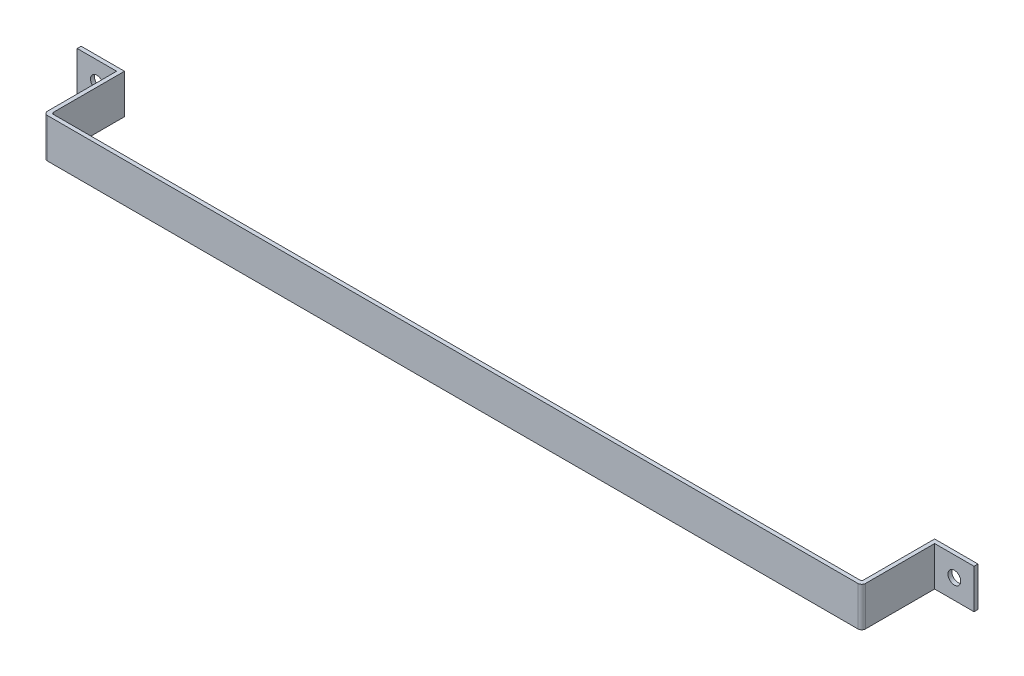
ISO-10303-21;
HEADER;
FILE_DESCRIPTION(('STEP AP214'),'2;1');
FILE_NAME('part.step','',(''),(''),'','','');
FILE_SCHEMA(('AUTOMOTIVE_DESIGN { 1 0 10303 214 1 1 1 1 }'));
ENDSEC;
DATA;
#1=APPLICATION_CONTEXT('core data for automotive mechanical design processes');
#2=APPLICATION_PROTOCOL_DEFINITION('international standard','automotive_design',2000,#1);
#3=PRODUCT_CONTEXT('',#1,'mechanical');
#4=PRODUCT('Part','Part','',(#3));
#5=PRODUCT_RELATED_PRODUCT_CATEGORY('part','',(#4));
#6=PRODUCT_DEFINITION_FORMATION('','',#4);
#7=PRODUCT_DEFINITION_CONTEXT('part definition',#1,'design');
#8=PRODUCT_DEFINITION('design','',#6,#7);
#9=PRODUCT_DEFINITION_SHAPE('','',#8);
#10=(LENGTH_UNIT() NAMED_UNIT(*) SI_UNIT(.MILLI.,.METRE.));
#11=(NAMED_UNIT(*) PLANE_ANGLE_UNIT() SI_UNIT($,.RADIAN.));
#12=(NAMED_UNIT(*) SI_UNIT($,.STERADIAN.) SOLID_ANGLE_UNIT());
#13=UNCERTAINTY_MEASURE_WITH_UNIT(LENGTH_MEASURE(1.E-05),#10,'distance_accuracy_value','');
#14=(GEOMETRIC_REPRESENTATION_CONTEXT(3) GLOBAL_UNCERTAINTY_ASSIGNED_CONTEXT((#13)) GLOBAL_UNIT_ASSIGNED_CONTEXT((#10,
#11,#12)) REPRESENTATION_CONTEXT('',''));
#15=CARTESIAN_POINT('',(0.,0.,0.));
#16=DIRECTION('',(0.,0.,1.));
#17=DIRECTION('',(1.,0.,0.));
#18=AXIS2_PLACEMENT_3D('',#15,#16,#17);
#19=CARTESIAN_POINT('',(425.,-10.,-2.));
#20=DIRECTION('',(1.,0.,0.));
#21=DIRECTION('',(0.,0.,-1.));
#22=AXIS2_PLACEMENT_3D('',#19,#20,#21);
#23=PLANE('',#22);
#24=DIRECTION('',(0.,0.,-1.));
#25=VECTOR('',#24,1.);
#26=CARTESIAN_POINT('',(425.,10.,-2.));
#27=LINE('',#26,#25);
#28=CARTESIAN_POINT('',(425.,10.,0.));
#29=VERTEX_POINT('',#28);
#30=CARTESIAN_POINT('',(425.,10.,35.));
#31=VERTEX_POINT('',#30);
#32=EDGE_CURVE('E183',#29,#31,#27,.F.);
#33=ORIENTED_EDGE('',*,*,#32,.T.);
#34=DIRECTION('',(0.,1.,0.));
#35=VECTOR('',#34,1.);
#36=CARTESIAN_POINT('',(425.,-10.,35.));
#37=LINE('',#36,#35);
#38=CARTESIAN_POINT('',(425.,-10.,35.));
#39=VERTEX_POINT('',#38);
#40=EDGE_CURVE('E275',#31,#39,#37,.F.);
#41=ORIENTED_EDGE('',*,*,#40,.T.);
#42=DIRECTION('',(0.,0.,1.));
#43=VECTOR('',#42,1.);
#44=CARTESIAN_POINT('',(425.,-10.,-2.));
#45=LINE('',#44,#43);
#46=CARTESIAN_POINT('',(425.,-10.,0.));
#47=VERTEX_POINT('',#46);
#48=EDGE_CURVE('E186',#47,#39,#45,.T.);
#49=ORIENTED_EDGE('',*,*,#48,.F.);
#50=DIRECTION('',(0.,1.,0.));
#51=VECTOR('',#50,1.);
#52=CARTESIAN_POINT('',(425.,-10.,0.));
#53=LINE('',#52,#51);
#54=EDGE_CURVE('E134',#47,#29,#53,.T.);
#55=ORIENTED_EDGE('',*,*,#54,.T.);
#56=EDGE_LOOP('',(#33,#41,#49,#55));
#57=FACE_BOUND('',#56,.T.);
#58=ADVANCED_FACE('F17',(#57),#23,.T.);
#59=CARTESIAN_POINT('',(12.,-10.,-2.));
#60=DIRECTION('',(1.,0.,0.));
#61=DIRECTION('',(0.,0.,-1.));
#62=AXIS2_PLACEMENT_3D('',#59,#60,#61);
#63=PLANE('',#62);
#64=DIRECTION('',(0.,0.,1.));
#65=VECTOR('',#64,1.);
#66=CARTESIAN_POINT('',(12.,10.,-2.));
#67=LINE('',#66,#65);
#68=CARTESIAN_POINT('',(12.,10.,-2.));
#69=VERTEX_POINT('',#68);
#70=CARTESIAN_POINT('',(12.,10.,34.));
#71=VERTEX_POINT('',#70);
#72=EDGE_CURVE('E236',#69,#71,#67,.T.);
#73=ORIENTED_EDGE('',*,*,#72,.T.);
#74=DIRECTION('',(0.,-1.,0.));
#75=VECTOR('',#74,1.);
#76=CARTESIAN_POINT('',(12.,-10.,34.));
#77=LINE('',#76,#75);
#78=CARTESIAN_POINT('',(12.,-10.,34.));
#79=VERTEX_POINT('',#78);
#80=EDGE_CURVE('E245',#71,#79,#77,.T.);
#81=ORIENTED_EDGE('',*,*,#80,.T.);
#82=DIRECTION('',(0.,0.,1.));
#83=VECTOR('',#82,1.);
#84=CARTESIAN_POINT('',(12.,-10.,-2.));
#85=LINE('',#84,#83);
#86=CARTESIAN_POINT('',(12.,-10.,-2.));
#87=VERTEX_POINT('',#86);
#88=EDGE_CURVE('E239',#87,#79,#85,.T.);
#89=ORIENTED_EDGE('',*,*,#88,.F.);
#90=DIRECTION('',(0.,1.,0.));
#91=VECTOR('',#90,1.);
#92=CARTESIAN_POINT('',(12.,-10.,-2.));
#93=LINE('',#92,#91);
#94=EDGE_CURVE('E215',#87,#69,#93,.T.);
#95=ORIENTED_EDGE('',*,*,#94,.T.);
#96=EDGE_LOOP('',(#73,#81,#89,#95));
#97=FACE_BOUND('',#96,.T.);
#98=ADVANCED_FACE('F305',(#97),#63,.T.);
#99=CARTESIAN_POINT('',(0.,0.,0.));
#100=DIRECTION('',(0.,0.,1.));
#101=DIRECTION('',(1.,0.,0.));
#102=AXIS2_PLACEMENT_3D('',#99,#100,#101);
#103=PLANE('',#102);
#104=CARTESIAN_POINT('',(0.,0.,0.));
#105=DIRECTION('',(0.,0.,-1.));
#106=DIRECTION('',(0.,1.,0.));
#107=AXIS2_PLACEMENT_3D('',#104,#105,#106);
#108=CIRCLE('',#107,3.25);
#109=CARTESIAN_POINT('',(0.,3.25,0.));
#110=VERTEX_POINT('',#109);
#111=EDGE_CURVE('E250',#110,#110,#108,.T.);
#112=ORIENTED_EDGE('',*,*,#111,.T.);
#113=EDGE_LOOP('',(#112));
#114=FACE_BOUND('',#113,.T.);
#115=DIRECTION('',(1.,0.,0.));
#116=VECTOR('',#115,1.);
#117=CARTESIAN_POINT('',(-10.,-10.,0.));
#118=LINE('',#117,#116);
#119=CARTESIAN_POINT('',(-10.,-10.,0.));
#120=VERTEX_POINT('',#119);
#121=CARTESIAN_POINT('',(10.,-10.,0.));
#122=VERTEX_POINT('',#121);
#123=EDGE_CURVE('E208',#120,#122,#118,.T.);
#124=ORIENTED_EDGE('',*,*,#123,.T.);
#125=DIRECTION('',(0.,1.,0.));
#126=VECTOR('',#125,1.);
#127=CARTESIAN_POINT('',(10.,0.,0.));
#128=LINE('',#127,#126);
#129=CARTESIAN_POINT('',(10.,10.,0.));
#130=VERTEX_POINT('',#129);
#131=EDGE_CURVE('E194',#122,#130,#128,.T.);
#132=ORIENTED_EDGE('',*,*,#131,.T.);
#133=DIRECTION('',(-1.,0.,0.));
#134=VECTOR('',#133,1.);
#135=CARTESIAN_POINT('',(10.,10.,0.));
#136=LINE('',#135,#134);
#137=CARTESIAN_POINT('',(-10.,10.,0.));
#138=VERTEX_POINT('',#137);
#139=EDGE_CURVE('E223',#130,#138,#136,.T.);
#140=ORIENTED_EDGE('',*,*,#139,.T.);
#141=DIRECTION('',(0.,-1.,0.));
#142=VECTOR('',#141,1.);
#143=CARTESIAN_POINT('',(-10.,10.,0.));
#144=LINE('',#143,#142);
#145=EDGE_CURVE('E222',#138,#120,#144,.T.);
#146=ORIENTED_EDGE('',*,*,#145,.T.);
#147=EDGE_LOOP('',(#124,#132,#140,#146));
#148=FACE_BOUND('',#147,.T.);
#149=ADVANCED_FACE('F294',(#114,#148),#103,.T.);
#150=CARTESIAN_POINT('',(-10.,-10.,-2.));
#151=DIRECTION('',(0.,-1.,0.));
#152=DIRECTION('',(0.,0.,-1.));
#153=AXIS2_PLACEMENT_3D('',#150,#151,#152);
#154=PLANE('',#153);
#155=DIRECTION('',(-1.,0.,0.));
#156=VECTOR('',#155,1.);
#157=CARTESIAN_POINT('',(-10.,-10.,37.));
#158=LINE('',#157,#156);
#159=CARTESIAN_POINT('',(12.,-10.,37.));
#160=VERTEX_POINT('',#159);
#161=CARTESIAN_POINT('',(423.,-10.,37.));
#162=VERTEX_POINT('',#161);
#163=EDGE_CURVE('E201',#160,#162,#158,.F.);
#164=ORIENTED_EDGE('',*,*,#163,.F.);
#165=CARTESIAN_POINT('',(12.,-10.,35.));
#166=DIRECTION('',(0.,-1.,0.));
#167=DIRECTION('',(0.,0.,-1.));
#168=AXIS2_PLACEMENT_3D('',#165,#166,#167);
#169=CIRCLE('',#168,2.);
#170=CARTESIAN_POINT('',(10.,-10.,35.));
#171=VERTEX_POINT('',#170);
#172=EDGE_CURVE('E11',#160,#171,#169,.T.);
#173=ORIENTED_EDGE('',*,*,#172,.T.);
#174=DIRECTION('',(0.,0.,1.));
#175=VECTOR('',#174,1.);
#176=CARTESIAN_POINT('',(10.,-10.,37.));
#177=LINE('',#176,#175);
#178=EDGE_CURVE('E206',#171,#122,#177,.F.);
#179=ORIENTED_EDGE('',*,*,#178,.T.);
#180=ORIENTED_EDGE('',*,*,#123,.F.);
#181=DIRECTION('',(0.,0.,1.));
#182=VECTOR('',#181,1.);
#183=CARTESIAN_POINT('',(-10.,-10.,-2.));
#184=LINE('',#183,#182);
#185=CARTESIAN_POINT('',(-10.,-10.,-2.));
#186=VERTEX_POINT('',#185);
#187=EDGE_CURVE('E218',#186,#120,#184,.T.);
#188=ORIENTED_EDGE('',*,*,#187,.F.);
#189=DIRECTION('',(1.,0.,0.));
#190=VECTOR('',#189,1.);
#191=CARTESIAN_POINT('',(-10.,-10.,-2.));
#192=LINE('',#191,#190);
#193=EDGE_CURVE('E219',#186,#87,#192,.T.);
#194=ORIENTED_EDGE('',*,*,#193,.T.);
#195=ORIENTED_EDGE('',*,*,#88,.T.);
#196=CARTESIAN_POINT('',(13.,-10.,34.));
#197=DIRECTION('',(0.,-1.,0.));
#198=DIRECTION('',(0.,0.,-1.));
#199=AXIS2_PLACEMENT_3D('',#196,#197,#198);
#200=CIRCLE('',#199,1.);
#201=CARTESIAN_POINT('',(13.,-10.,35.));
#202=VERTEX_POINT('',#201);
#203=EDGE_CURVE('E256',#79,#202,#200,.F.);
#204=ORIENTED_EDGE('',*,*,#203,.T.);
#205=DIRECTION('',(-1.,0.,0.));
#206=VECTOR('',#205,1.);
#207=CARTESIAN_POINT('',(425.,-10.,35.));
#208=LINE('',#207,#206);
#209=CARTESIAN_POINT('',(422.,-10.,35.));
#210=VERTEX_POINT('',#209);
#211=EDGE_CURVE('E189',#210,#202,#208,.T.);
#212=ORIENTED_EDGE('',*,*,#211,.F.);
#213=CARTESIAN_POINT('',(422.,-10.,34.));
#214=DIRECTION('',(0.,-1.,0.));
#215=DIRECTION('',(0.,0.,-1.));
#216=AXIS2_PLACEMENT_3D('',#213,#214,#215);
#217=CIRCLE('',#216,1.);
#218=CARTESIAN_POINT('',(423.,-10.,34.));
#219=VERTEX_POINT('',#218);
#220=EDGE_CURVE('E266',#210,#219,#217,.F.);
#221=ORIENTED_EDGE('',*,*,#220,.T.);
#222=DIRECTION('',(0.,0.,1.));
#223=VECTOR('',#222,1.);
#224=CARTESIAN_POINT('',(423.,-10.,-2.));
#225=LINE('',#224,#223);
#226=CARTESIAN_POINT('',(423.,-10.,-2.));
#227=VERTEX_POINT('',#226);
#228=EDGE_CURVE('E177',#227,#219,#225,.T.);
#229=ORIENTED_EDGE('',*,*,#228,.F.);
#230=DIRECTION('',(-1.,0.,0.));
#231=VECTOR('',#230,1.);
#232=CARTESIAN_POINT('',(425.,-10.,-2.));
#233=LINE('',#232,#231);
#234=CARTESIAN_POINT('',(445.,-10.,-2.));
#235=VERTEX_POINT('',#234);
#236=EDGE_CURVE('E155',#235,#227,#233,.T.);
#237=ORIENTED_EDGE('',*,*,#236,.F.);
#238=DIRECTION('',(0.,0.,1.));
#239=VECTOR('',#238,1.);
#240=CARTESIAN_POINT('',(445.,-10.,-2.));
#241=LINE('',#240,#239);
#242=CARTESIAN_POINT('',(445.,-10.,0.));
#243=VERTEX_POINT('',#242);
#244=EDGE_CURVE('E146',#235,#243,#241,.T.);
#245=ORIENTED_EDGE('',*,*,#244,.T.);
#246=DIRECTION('',(-1.,0.,0.));
#247=VECTOR('',#246,1.);
#248=CARTESIAN_POINT('',(445.,-10.,0.));
#249=LINE('',#248,#247);
#250=EDGE_CURVE('E129',#243,#47,#249,.T.);
#251=ORIENTED_EDGE('',*,*,#250,.T.);
#252=ORIENTED_EDGE('',*,*,#48,.T.);
#253=CARTESIAN_POINT('',(423.,-10.,35.));
#254=DIRECTION('',(0.,-1.,0.));
#255=DIRECTION('',(0.,0.,-1.));
#256=AXIS2_PLACEMENT_3D('',#253,#254,#255);
#257=CIRCLE('',#256,2.);
#258=EDGE_CURVE('E277',#39,#162,#257,.T.);
#259=ORIENTED_EDGE('',*,*,#258,.T.);
#260=EDGE_LOOP('',(#164,#173,#179,#180,#188,#194,#195,#204,#212,#221,#229,#237,#245,#251,#252,#259));
#261=FACE_BOUND('',#260,.T.);
#262=ADVANCED_FACE('F153',(#261),#154,.T.);
#263=CARTESIAN_POINT('',(10.,10.,-2.));
#264=DIRECTION('',(0.,1.,0.));
#265=DIRECTION('',(0.,0.,1.));
#266=AXIS2_PLACEMENT_3D('',#263,#264,#265);
#267=PLANE('',#266);
#268=DIRECTION('',(0.,0.,-1.));
#269=VECTOR('',#268,1.);
#270=CARTESIAN_POINT('',(10.,10.,37.));
#271=LINE('',#270,#269);
#272=CARTESIAN_POINT('',(10.,10.,35.));
#273=VERTEX_POINT('',#272);
#274=EDGE_CURVE('E200',#273,#130,#271,.T.);
#275=ORIENTED_EDGE('',*,*,#274,.F.);
#276=CARTESIAN_POINT('',(12.,10.,35.));
#277=DIRECTION('',(0.,1.,0.));
#278=DIRECTION('',(0.,0.,1.));
#279=AXIS2_PLACEMENT_3D('',#276,#277,#278);
#280=CIRCLE('',#279,2.);
#281=CARTESIAN_POINT('',(12.,10.,37.));
#282=VERTEX_POINT('',#281);
#283=EDGE_CURVE('E39',#273,#282,#280,.T.);
#284=ORIENTED_EDGE('',*,*,#283,.T.);
#285=DIRECTION('',(-1.,0.,0.));
#286=VECTOR('',#285,1.);
#287=CARTESIAN_POINT('',(10.,10.,37.));
#288=LINE('',#287,#286);
#289=CARTESIAN_POINT('',(423.,10.,37.));
#290=VERTEX_POINT('',#289);
#291=EDGE_CURVE('E197',#290,#282,#288,.T.);
#292=ORIENTED_EDGE('',*,*,#291,.F.);
#293=CARTESIAN_POINT('',(423.,10.,35.));
#294=DIRECTION('',(0.,1.,0.));
#295=DIRECTION('',(0.,0.,1.));
#296=AXIS2_PLACEMENT_3D('',#293,#294,#295);
#297=CIRCLE('',#296,2.);
#298=EDGE_CURVE('E273',#290,#31,#297,.T.);
#299=ORIENTED_EDGE('',*,*,#298,.T.);
#300=ORIENTED_EDGE('',*,*,#32,.F.);
#301=DIRECTION('',(1.,0.,0.));
#302=VECTOR('',#301,1.);
#303=CARTESIAN_POINT('',(10.,10.,0.));
#304=LINE('',#303,#302);
#305=CARTESIAN_POINT('',(445.,10.,0.));
#306=VERTEX_POINT('',#305);
#307=EDGE_CURVE('E140',#306,#29,#304,.F.);
#308=ORIENTED_EDGE('',*,*,#307,.F.);
#309=DIRECTION('',(0.,0.,-1.));
#310=VECTOR('',#309,1.);
#311=CARTESIAN_POINT('',(445.,10.,-2.));
#312=LINE('',#311,#310);
#313=CARTESIAN_POINT('',(445.,10.,-2.));
#314=VERTEX_POINT('',#313);
#315=EDGE_CURVE('E149',#314,#306,#312,.F.);
#316=ORIENTED_EDGE('',*,*,#315,.F.);
#317=DIRECTION('',(-1.,0.,0.));
#318=VECTOR('',#317,1.);
#319=CARTESIAN_POINT('',(10.,10.,-2.));
#320=LINE('',#319,#318);
#321=CARTESIAN_POINT('',(423.,10.,-2.));
#322=VERTEX_POINT('',#321);
#323=EDGE_CURVE('E174',#314,#322,#320,.T.);
#324=ORIENTED_EDGE('',*,*,#323,.T.);
#325=DIRECTION('',(0.,0.,1.));
#326=VECTOR('',#325,1.);
#327=CARTESIAN_POINT('',(423.,10.,-2.));
#328=LINE('',#327,#326);
#329=CARTESIAN_POINT('',(423.,10.,34.));
#330=VERTEX_POINT('',#329);
#331=EDGE_CURVE('E180',#322,#330,#328,.T.);
#332=ORIENTED_EDGE('',*,*,#331,.T.);
#333=CARTESIAN_POINT('',(422.,10.,34.));
#334=DIRECTION('',(0.,1.,0.));
#335=DIRECTION('',(0.,0.,1.));
#336=AXIS2_PLACEMENT_3D('',#333,#334,#335);
#337=CIRCLE('',#336,1.);
#338=CARTESIAN_POINT('',(422.,10.,35.));
#339=VERTEX_POINT('',#338);
#340=EDGE_CURVE('E268',#330,#339,#337,.F.);
#341=ORIENTED_EDGE('',*,*,#340,.T.);
#342=DIRECTION('',(1.,0.,0.));
#343=VECTOR('',#342,1.);
#344=CARTESIAN_POINT('',(425.,10.,35.));
#345=LINE('',#344,#343);
#346=CARTESIAN_POINT('',(13.,10.,35.));
#347=VERTEX_POINT('',#346);
#348=EDGE_CURVE('E192',#339,#347,#345,.F.);
#349=ORIENTED_EDGE('',*,*,#348,.T.);
#350=CARTESIAN_POINT('',(13.,10.,34.));
#351=DIRECTION('',(0.,1.,0.));
#352=DIRECTION('',(0.,0.,1.));
#353=AXIS2_PLACEMENT_3D('',#350,#351,#352);
#354=CIRCLE('',#353,1.);
#355=EDGE_CURVE('E259',#347,#71,#354,.F.);
#356=ORIENTED_EDGE('',*,*,#355,.T.);
#357=ORIENTED_EDGE('',*,*,#72,.F.);
#358=DIRECTION('',(-1.,0.,0.));
#359=VECTOR('',#358,1.);
#360=CARTESIAN_POINT('',(10.,10.,-2.));
#361=LINE('',#360,#359);
#362=CARTESIAN_POINT('',(-10.,10.,-2.));
#363=VERTEX_POINT('',#362);
#364=EDGE_CURVE('E211',#69,#363,#361,.T.);
#365=ORIENTED_EDGE('',*,*,#364,.T.);
#366=DIRECTION('',(0.,0.,1.));
#367=VECTOR('',#366,1.);
#368=CARTESIAN_POINT('',(-10.,10.,-2.));
#369=LINE('',#368,#367);
#370=EDGE_CURVE('E233',#363,#138,#369,.T.);
#371=ORIENTED_EDGE('',*,*,#370,.T.);
#372=ORIENTED_EDGE('',*,*,#139,.F.);
#373=EDGE_LOOP('',(#275,#284,#292,#299,#300,#308,#316,#324,#332,#341,#349,#356,#357,#365,#371,#372));
#374=FACE_BOUND('',#373,.T.);
#375=ADVANCED_FACE('F291',(#374),#267,.T.);
#376=CARTESIAN_POINT('',(-10.,10.,-2.));
#377=DIRECTION('',(-1.,0.,0.));
#378=DIRECTION('',(0.,0.,1.));
#379=AXIS2_PLACEMENT_3D('',#376,#377,#378);
#380=PLANE('',#379);
#381=ORIENTED_EDGE('',*,*,#145,.F.);
#382=ORIENTED_EDGE('',*,*,#370,.F.);
#383=DIRECTION('',(0.,-1.,0.));
#384=VECTOR('',#383,1.);
#385=CARTESIAN_POINT('',(-10.,10.,-2.));
#386=LINE('',#385,#384);
#387=EDGE_CURVE('E214',#363,#186,#386,.T.);
#388=ORIENTED_EDGE('',*,*,#387,.T.);
#389=ORIENTED_EDGE('',*,*,#187,.T.);
#390=EDGE_LOOP('',(#381,#382,#388,#389));
#391=FACE_BOUND('',#390,.T.);
#392=ADVANCED_FACE('F329',(#391),#380,.T.);
#393=CARTESIAN_POINT('',(0.,0.,-2.));
#394=DIRECTION('',(0.,0.,1.));
#395=DIRECTION('',(1.,0.,0.));
#396=AXIS2_PLACEMENT_3D('',#393,#394,#395);
#397=PLANE('',#396);
#398=CARTESIAN_POINT('',(0.,0.,-2.));
#399=DIRECTION('',(0.,0.,1.));
#400=DIRECTION('',(1.,0.,0.));
#401=AXIS2_PLACEMENT_3D('',#398,#399,#400);
#402=CIRCLE('',#401,3.25);
#403=CARTESIAN_POINT('',(3.25,0.,-2.));
#404=VERTEX_POINT('',#403);
#405=EDGE_CURVE('E246',#404,#404,#402,.F.);
#406=ORIENTED_EDGE('',*,*,#405,.F.);
#407=EDGE_LOOP('',(#406));
#408=FACE_BOUND('',#407,.T.);
#409=ORIENTED_EDGE('',*,*,#193,.F.);
#410=ORIENTED_EDGE('',*,*,#387,.F.);
#411=ORIENTED_EDGE('',*,*,#364,.F.);
#412=ORIENTED_EDGE('',*,*,#94,.F.);
#413=EDGE_LOOP('',(#409,#410,#411,#412));
#414=FACE_BOUND('',#413,.T.);
#415=ADVANCED_FACE('F326',(#408,#414),#397,.F.);
#416=CARTESIAN_POINT('',(10.,0.,37.));
#417=DIRECTION('',(-1.,0.,0.));
#418=DIRECTION('',(0.,0.,1.));
#419=AXIS2_PLACEMENT_3D('',#416,#417,#418);
#420=PLANE('',#419);
#421=ORIENTED_EDGE('',*,*,#178,.F.);
#422=DIRECTION('',(0.,1.,0.));
#423=VECTOR('',#422,1.);
#424=CARTESIAN_POINT('',(10.,0.,35.));
#425=LINE('',#424,#423);
#426=EDGE_CURVE('E280',#171,#273,#425,.T.);
#427=ORIENTED_EDGE('',*,*,#426,.T.);
#428=ORIENTED_EDGE('',*,*,#274,.T.);
#429=ORIENTED_EDGE('',*,*,#131,.F.);
#430=EDGE_LOOP('',(#421,#427,#428,#429));
#431=FACE_BOUND('',#430,.T.);
#432=ADVANCED_FACE('F286',(#431),#420,.T.);
#433=CARTESIAN_POINT('',(0.,0.,37.));
#434=DIRECTION('',(0.,0.,1.));
#435=DIRECTION('',(1.,0.,0.));
#436=AXIS2_PLACEMENT_3D('',#433,#434,#435);
#437=PLANE('',#436);
#438=ORIENTED_EDGE('',*,*,#291,.T.);
#439=DIRECTION('',(0.,1.,0.));
#440=VECTOR('',#439,1.);
#441=CARTESIAN_POINT('',(12.,0.,37.));
#442=LINE('',#441,#440);
#443=EDGE_CURVE('E25',#282,#160,#442,.F.);
#444=ORIENTED_EDGE('',*,*,#443,.T.);
#445=ORIENTED_EDGE('',*,*,#163,.T.);
#446=DIRECTION('',(0.,1.,0.));
#447=VECTOR('',#446,1.);
#448=CARTESIAN_POINT('',(423.,0.,37.));
#449=LINE('',#448,#447);
#450=EDGE_CURVE('E270',#162,#290,#449,.T.);
#451=ORIENTED_EDGE('',*,*,#450,.T.);
#452=EDGE_LOOP('',(#438,#444,#445,#451));
#453=FACE_BOUND('',#452,.T.);
#454=ADVANCED_FACE('F320',(#453),#437,.T.);
#455=CARTESIAN_POINT('',(425.,-10.,35.));
#456=DIRECTION('',(0.,0.,-1.));
#457=DIRECTION('',(-1.,0.,0.));
#458=AXIS2_PLACEMENT_3D('',#455,#456,#457);
#459=PLANE('',#458);
#460=ORIENTED_EDGE('',*,*,#348,.F.);
#461=DIRECTION('',(0.,-1.,0.));
#462=VECTOR('',#461,1.);
#463=CARTESIAN_POINT('',(422.,-10.,35.));
#464=LINE('',#463,#462);
#465=EDGE_CURVE('E261',#339,#210,#464,.T.);
#466=ORIENTED_EDGE('',*,*,#465,.T.);
#467=ORIENTED_EDGE('',*,*,#211,.T.);
#468=DIRECTION('',(0.,-1.,0.));
#469=VECTOR('',#468,1.);
#470=CARTESIAN_POINT('',(13.,10.,35.));
#471=LINE('',#470,#469);
#472=EDGE_CURVE('E253',#202,#347,#471,.F.);
#473=ORIENTED_EDGE('',*,*,#472,.T.);
#474=EDGE_LOOP('',(#460,#466,#467,#473));
#475=FACE_BOUND('',#474,.T.);
#476=ADVANCED_FACE('F317',(#475),#459,.T.);
#477=CARTESIAN_POINT('',(423.,-10.,-2.));
#478=DIRECTION('',(-1.,0.,0.));
#479=DIRECTION('',(0.,0.,1.));
#480=AXIS2_PLACEMENT_3D('',#477,#478,#479);
#481=PLANE('',#480);
#482=ORIENTED_EDGE('',*,*,#228,.T.);
#483=DIRECTION('',(0.,-1.,0.));
#484=VECTOR('',#483,1.);
#485=CARTESIAN_POINT('',(423.,10.,34.));
#486=LINE('',#485,#484);
#487=EDGE_CURVE('E264',#219,#330,#486,.F.);
#488=ORIENTED_EDGE('',*,*,#487,.T.);
#489=ORIENTED_EDGE('',*,*,#331,.F.);
#490=DIRECTION('',(0.,-1.,0.));
#491=VECTOR('',#490,1.);
#492=CARTESIAN_POINT('',(423.,-10.,-2.));
#493=LINE('',#492,#491);
#494=EDGE_CURVE('E139',#322,#227,#493,.T.);
#495=ORIENTED_EDGE('',*,*,#494,.T.);
#496=EDGE_LOOP('',(#482,#488,#489,#495));
#497=FACE_BOUND('',#496,.T.);
#498=ADVANCED_FACE('F315',(#497),#481,.T.);
#499=CARTESIAN_POINT('',(425.,-10.,-2.));
#500=DIRECTION('',(0.,0.,-1.));
#501=DIRECTION('',(-1.,0.,0.));
#502=AXIS2_PLACEMENT_3D('',#499,#500,#501);
#503=PLANE('',#502);
#504=CARTESIAN_POINT('',(435.,0.,-2.));
#505=DIRECTION('',(0.,0.,-1.));
#506=DIRECTION('',(-1.,0.,0.));
#507=AXIS2_PLACEMENT_3D('',#504,#505,#506);
#508=CIRCLE('',#507,3.25);
#509=CARTESIAN_POINT('',(431.75,0.,-2.));
#510=VERTEX_POINT('',#509);
#511=EDGE_CURVE('E167',#510,#510,#508,.F.);
#512=ORIENTED_EDGE('',*,*,#511,.T.);
#513=EDGE_LOOP('',(#512));
#514=FACE_BOUND('',#513,.T.);
#515=ORIENTED_EDGE('',*,*,#494,.F.);
#516=ORIENTED_EDGE('',*,*,#323,.F.);
#517=DIRECTION('',(0.,-1.,0.));
#518=VECTOR('',#517,1.);
#519=CARTESIAN_POINT('',(445.,-10.,-2.));
#520=LINE('',#519,#518);
#521=EDGE_CURVE('E157',#314,#235,#520,.T.);
#522=ORIENTED_EDGE('',*,*,#521,.T.);
#523=ORIENTED_EDGE('',*,*,#236,.T.);
#524=EDGE_LOOP('',(#515,#516,#522,#523));
#525=FACE_BOUND('',#524,.T.);
#526=ADVANCED_FACE('F366',(#514,#525),#503,.T.);
#527=CARTESIAN_POINT('',(445.,-10.,0.));
#528=DIRECTION('',(0.,0.,1.));
#529=DIRECTION('',(0.,-1.,0.));
#530=AXIS2_PLACEMENT_3D('',#527,#528,#529);
#531=PLANE('',#530);
#532=CARTESIAN_POINT('',(435.,0.,0.));
#533=DIRECTION('',(0.,0.,-1.));
#534=DIRECTION('',(0.,1.,0.));
#535=AXIS2_PLACEMENT_3D('',#532,#533,#534);
#536=CIRCLE('',#535,3.25);
#537=CARTESIAN_POINT('',(435.,3.25,0.));
#538=VERTEX_POINT('',#537);
#539=EDGE_CURVE('E249',#538,#538,#536,.T.);
#540=ORIENTED_EDGE('',*,*,#539,.T.);
#541=EDGE_LOOP('',(#540));
#542=FACE_BOUND('',#541,.T.);
#543=ORIENTED_EDGE('',*,*,#54,.F.);
#544=ORIENTED_EDGE('',*,*,#250,.F.);
#545=DIRECTION('',(0.,1.,0.));
#546=VECTOR('',#545,1.);
#547=CARTESIAN_POINT('',(445.,-10.,0.));
#548=LINE('',#547,#546);
#549=EDGE_CURVE('E132',#243,#306,#548,.T.);
#550=ORIENTED_EDGE('',*,*,#549,.T.);
#551=ORIENTED_EDGE('',*,*,#307,.T.);
#552=EDGE_LOOP('',(#543,#544,#550,#551));
#553=FACE_BOUND('',#552,.T.);
#554=ADVANCED_FACE('F131',(#542,#553),#531,.T.);
#555=CARTESIAN_POINT('',(445.,-10.,-2.));
#556=DIRECTION('',(1.,0.,0.));
#557=DIRECTION('',(0.,0.,-1.));
#558=AXIS2_PLACEMENT_3D('',#555,#556,#557);
#559=PLANE('',#558);
#560=ORIENTED_EDGE('',*,*,#549,.F.);
#561=ORIENTED_EDGE('',*,*,#244,.F.);
#562=ORIENTED_EDGE('',*,*,#521,.F.);
#563=ORIENTED_EDGE('',*,*,#315,.T.);
#564=EDGE_LOOP('',(#560,#561,#562,#563));
#565=FACE_BOUND('',#564,.T.);
#566=ADVANCED_FACE('F144',(#565),#559,.T.);
#567=CARTESIAN_POINT('',(435.,0.,-47.8985639851897));
#568=DIRECTION('',(0.,0.,1.));
#569=DIRECTION('',(1.,0.,0.));
#570=AXIS2_PLACEMENT_3D('',#567,#568,#569);
#571=CYLINDRICAL_SURFACE('',#570,3.25);
#572=ORIENTED_EDGE('',*,*,#511,.F.);
#573=EDGE_LOOP('',(#572));
#574=FACE_BOUND('',#573,.T.);
#575=ORIENTED_EDGE('',*,*,#539,.F.);
#576=EDGE_LOOP('',(#575));
#577=FACE_BOUND('',#576,.T.);
#578=ADVANCED_FACE('F383',(#574,#577),#571,.F.);
#579=CARTESIAN_POINT('',(0.,0.,-47.8985639851897));
#580=DIRECTION('',(0.,0.,1.));
#581=DIRECTION('',(1.,0.,0.));
#582=AXIS2_PLACEMENT_3D('',#579,#580,#581);
#583=CYLINDRICAL_SURFACE('',#582,3.25);
#584=ORIENTED_EDGE('',*,*,#111,.F.);
#585=EDGE_LOOP('',(#584));
#586=FACE_BOUND('',#585,.T.);
#587=ORIENTED_EDGE('',*,*,#405,.T.);
#588=EDGE_LOOP('',(#587));
#589=FACE_BOUND('',#588,.T.);
#590=ADVANCED_FACE('F344',(#586,#589),#583,.F.);
#591=CARTESIAN_POINT('',(13.,-10.,34.));
#592=DIRECTION('',(0.,1.,0.));
#593=DIRECTION('',(0.,0.,1.));
#594=AXIS2_PLACEMENT_3D('',#591,#592,#593);
#595=CYLINDRICAL_SURFACE('',#594,1.);
#596=ORIENTED_EDGE('',*,*,#355,.F.);
#597=ORIENTED_EDGE('',*,*,#472,.F.);
#598=ORIENTED_EDGE('',*,*,#203,.F.);
#599=ORIENTED_EDGE('',*,*,#80,.F.);
#600=EDGE_LOOP('',(#596,#597,#598,#599));
#601=FACE_BOUND('',#600,.T.);
#602=ADVANCED_FACE('F341',(#601),#595,.F.);
#603=CARTESIAN_POINT('',(422.,-10.,34.));
#604=DIRECTION('',(0.,1.,0.));
#605=DIRECTION('',(0.,0.,1.));
#606=AXIS2_PLACEMENT_3D('',#603,#604,#605);
#607=CYLINDRICAL_SURFACE('',#606,1.);
#608=ORIENTED_EDGE('',*,*,#340,.F.);
#609=ORIENTED_EDGE('',*,*,#487,.F.);
#610=ORIENTED_EDGE('',*,*,#220,.F.);
#611=ORIENTED_EDGE('',*,*,#465,.F.);
#612=EDGE_LOOP('',(#608,#609,#610,#611));
#613=FACE_BOUND('',#612,.T.);
#614=ADVANCED_FACE('F302',(#613),#607,.F.);
#615=CARTESIAN_POINT('',(423.,0.,35.));
#616=DIRECTION('',(0.,1.,0.));
#617=DIRECTION('',(0.,0.,1.));
#618=AXIS2_PLACEMENT_3D('',#615,#616,#617);
#619=CYLINDRICAL_SURFACE('',#618,2.);
#620=ORIENTED_EDGE('',*,*,#258,.F.);
#621=ORIENTED_EDGE('',*,*,#40,.F.);
#622=ORIENTED_EDGE('',*,*,#298,.F.);
#623=ORIENTED_EDGE('',*,*,#450,.F.);
#624=EDGE_LOOP('',(#620,#621,#622,#623));
#625=FACE_BOUND('',#624,.T.);
#626=ADVANCED_FACE('F297',(#625),#619,.T.);
#627=CARTESIAN_POINT('',(12.,0.,35.));
#628=DIRECTION('',(0.,1.,0.));
#629=DIRECTION('',(0.,0.,1.));
#630=AXIS2_PLACEMENT_3D('',#627,#628,#629);
#631=CYLINDRICAL_SURFACE('',#630,2.);
#632=ORIENTED_EDGE('',*,*,#172,.F.);
#633=ORIENTED_EDGE('',*,*,#443,.F.);
#634=ORIENTED_EDGE('',*,*,#283,.F.);
#635=ORIENTED_EDGE('',*,*,#426,.F.);
#636=EDGE_LOOP('',(#632,#633,#634,#635));
#637=FACE_BOUND('',#636,.T.);
#638=ADVANCED_FACE('F19',(#637),#631,.T.);
#639=CLOSED_SHELL('',(#58,#98,#149,#262,#375,#392,#415,#432,#454,#476,#498,#526,#554,#566,#578,
#590,#602,#614,#626,#638));
#640=MANIFOLD_SOLID_BREP('B1',#639);
#641=ADVANCED_BREP_SHAPE_REPRESENTATION('',(#18,#640),#14);
#642=SHAPE_DEFINITION_REPRESENTATION(#9,#641);
ENDSEC;
END-ISO-10303-21;
